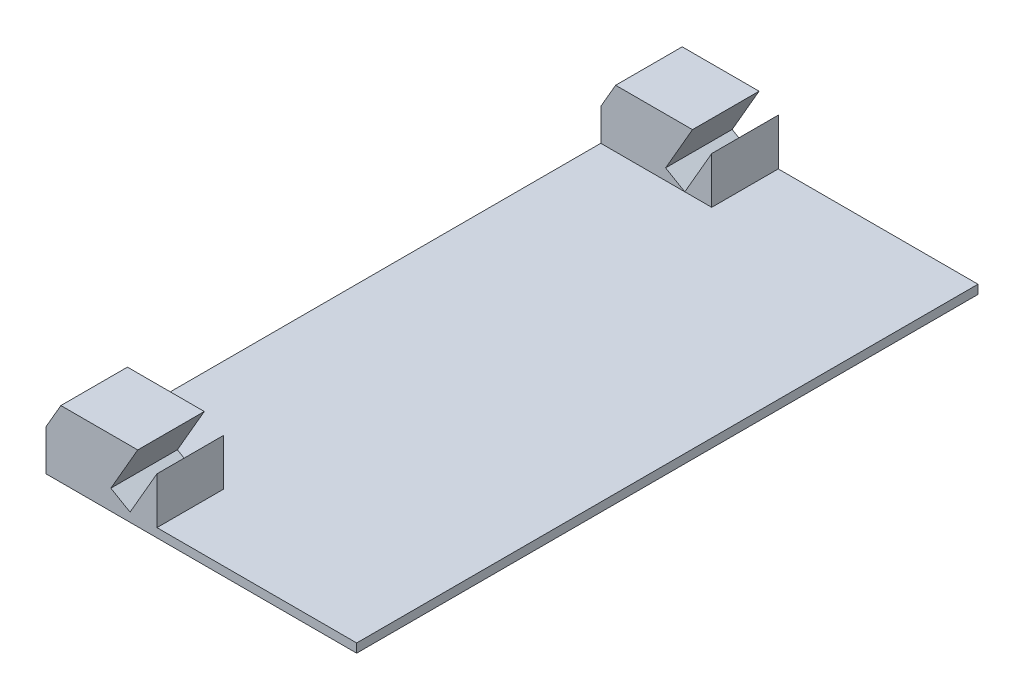
ISO-10303-21;
HEADER;
FILE_DESCRIPTION(('STEP AP214'),'2;1');
FILE_NAME('part.step','',(''),(''),'','','');
FILE_SCHEMA(('AUTOMOTIVE_DESIGN { 1 0 10303 214 1 1 1 1 }'));
ENDSEC;
DATA;
#1=APPLICATION_CONTEXT('core data for automotive mechanical design processes');
#2=APPLICATION_PROTOCOL_DEFINITION('international standard','automotive_design',2000,#1);
#3=PRODUCT_CONTEXT('',#1,'mechanical');
#4=PRODUCT('Part','Part','',(#3));
#5=PRODUCT_RELATED_PRODUCT_CATEGORY('part','',(#4));
#6=PRODUCT_DEFINITION_FORMATION('','',#4);
#7=PRODUCT_DEFINITION_CONTEXT('part definition',#1,'design');
#8=PRODUCT_DEFINITION('design','',#6,#7);
#9=PRODUCT_DEFINITION_SHAPE('','',#8);
#10=(LENGTH_UNIT() NAMED_UNIT(*) SI_UNIT(.MILLI.,.METRE.));
#11=(NAMED_UNIT(*) PLANE_ANGLE_UNIT() SI_UNIT($,.RADIAN.));
#12=(NAMED_UNIT(*) SI_UNIT($,.STERADIAN.) SOLID_ANGLE_UNIT());
#13=UNCERTAINTY_MEASURE_WITH_UNIT(LENGTH_MEASURE(1.E-05),#10,'distance_accuracy_value','');
#14=(GEOMETRIC_REPRESENTATION_CONTEXT(3) GLOBAL_UNCERTAINTY_ASSIGNED_CONTEXT((#13)) GLOBAL_UNIT_ASSIGNED_CONTEXT((#10,
#11,#12)) REPRESENTATION_CONTEXT('',''));
#15=CARTESIAN_POINT('',(0.,0.,0.));
#16=DIRECTION('',(0.,0.,1.));
#17=DIRECTION('',(1.,0.,0.));
#18=AXIS2_PLACEMENT_3D('',#15,#16,#17);
#19=CARTESIAN_POINT('',(-35.,2.,-70.));
#20=DIRECTION('',(0.,0.,1.));
#21=DIRECTION('',(1.,0.,0.));
#22=AXIS2_PLACEMENT_3D('',#19,#20,#21);
#23=PLANE('',#22);
#24=DIRECTION('',(0.,-1.,0.));
#25=VECTOR('',#24,1.);
#26=CARTESIAN_POINT('',(-35.,2.,-70.));
#27=LINE('',#26,#25);
#28=CARTESIAN_POINT('',(-35.,9.19872981077795,-70.));
#29=VERTEX_POINT('',#28);
#30=CARTESIAN_POINT('',(-35.,0.,-70.));
#31=VERTEX_POINT('',#30);
#32=EDGE_CURVE('E208',#29,#31,#27,.T.);
#33=ORIENTED_EDGE('',*,*,#32,.F.);
#34=DIRECTION('',(0.499999999999994,0.866025403784442,0.));
#35=VECTOR('',#34,1.);
#36=CARTESIAN_POINT('',(-30.2331668493416,17.455127018922,-70.));
#37=LINE('',#36,#35);
#38=CARTESIAN_POINT('',(-31.650635094611,15.,-70.));
#39=VERTEX_POINT('',#38);
#40=EDGE_CURVE('E190',#29,#39,#37,.T.);
#41=ORIENTED_EDGE('',*,*,#40,.T.);
#42=DIRECTION('',(-1.,0.,0.));
#43=VECTOR('',#42,1.);
#44=CARTESIAN_POINT('',(-35.,15.,-70.));
#45=LINE('',#44,#43);
#46=CARTESIAN_POINT('',(-14.3301270189222,15.,-70.));
#47=VERTEX_POINT('',#46);
#48=EDGE_CURVE('E269',#47,#39,#45,.T.);
#49=ORIENTED_EDGE('',*,*,#48,.F.);
#50=DIRECTION('',(0.499999999999997,0.86602540378444,0.));
#51=VECTOR('',#50,1.);
#52=CARTESIAN_POINT('',(-17.242785792575,9.95512701892214,-70.));
#53=LINE('',#52,#51);
#54=CARTESIAN_POINT('',(-20.3923048454133,4.49999999999997,-70.));
#55=VERTEX_POINT('',#54);
#56=EDGE_CURVE('E82',#55,#47,#53,.T.);
#57=ORIENTED_EDGE('',*,*,#56,.F.);
#58=DIRECTION('',(0.866025403784442,-0.499999999999994,0.));
#59=VECTOR('',#58,1.);
#60=CARTESIAN_POINT('',(-3.14951905283824,-5.45512701892213,-70.));
#61=LINE('',#60,#59);
#62=CARTESIAN_POINT('',(-16.0621778264911,2.,-70.));
#63=VERTEX_POINT('',#62);
#64=EDGE_CURVE('E347',#55,#63,#61,.T.);
#65=ORIENTED_EDGE('',*,*,#64,.T.);
#66=DIRECTION('',(0.499999999999997,0.86602540378444,0.));
#67=VECTOR('',#66,1.);
#68=CARTESIAN_POINT('',(-12.9126587736528,7.45512701892215,-70.));
#69=LINE('',#68,#67);
#70=CARTESIAN_POINT('',(-10.,12.5,-70.));
#71=VERTEX_POINT('',#70);
#72=EDGE_CURVE('E355',#63,#71,#69,.T.);
#73=ORIENTED_EDGE('',*,*,#72,.T.);
#74=DIRECTION('',(0.,-1.,0.));
#75=VECTOR('',#74,1.);
#76=CARTESIAN_POINT('',(-10.,15.,-70.));
#77=LINE('',#76,#75);
#78=CARTESIAN_POINT('',(-10.,2.,-70.));
#79=VERTEX_POINT('',#78);
#80=EDGE_CURVE('E273',#71,#79,#77,.T.);
#81=ORIENTED_EDGE('',*,*,#80,.T.);
#82=DIRECTION('',(-1.,0.,0.));
#83=VECTOR('',#82,1.);
#84=CARTESIAN_POINT('',(-35.,2.,-70.));
#85=LINE('',#84,#83);
#86=CARTESIAN_POINT('',(35.,2.,-70.));
#87=VERTEX_POINT('',#86);
#88=EDGE_CURVE('E294',#87,#79,#85,.T.);
#89=ORIENTED_EDGE('',*,*,#88,.F.);
#90=DIRECTION('',(0.,-1.,0.));
#91=VECTOR('',#90,1.);
#92=CARTESIAN_POINT('',(35.,2.,-70.));
#93=LINE('',#92,#91);
#94=CARTESIAN_POINT('',(35.,0.,-70.));
#95=VERTEX_POINT('',#94);
#96=EDGE_CURVE('E218',#87,#95,#93,.T.);
#97=ORIENTED_EDGE('',*,*,#96,.T.);
#98=DIRECTION('',(-1.,0.,0.));
#99=VECTOR('',#98,1.);
#100=CARTESIAN_POINT('',(-35.,0.,-70.));
#101=LINE('',#100,#99);
#102=EDGE_CURVE('E215',#95,#31,#101,.T.);
#103=ORIENTED_EDGE('',*,*,#102,.T.);
#104=EDGE_LOOP('',(#33,#41,#49,#57,#65,#73,#81,#89,#97,#103));
#105=FACE_BOUND('',#104,.T.);
#106=ADVANCED_FACE('F66',(#105),#23,.F.);
#107=CARTESIAN_POINT('',(-35.,2.,70.));
#108=DIRECTION('',(0.,0.,-1.));
#109=DIRECTION('',(-1.,0.,0.));
#110=AXIS2_PLACEMENT_3D('',#107,#108,#109);
#111=PLANE('',#110);
#112=DIRECTION('',(1.,0.,0.));
#113=VECTOR('',#112,1.);
#114=CARTESIAN_POINT('',(-35.,15.,70.));
#115=LINE('',#114,#113);
#116=CARTESIAN_POINT('',(-31.650635094611,15.,70.));
#117=VERTEX_POINT('',#116);
#118=CARTESIAN_POINT('',(-14.3301270189222,15.,70.));
#119=VERTEX_POINT('',#118);
#120=EDGE_CURVE('E382',#117,#119,#115,.T.);
#121=ORIENTED_EDGE('',*,*,#120,.F.);
#122=DIRECTION('',(0.499999999999994,0.866025403784442,0.));
#123=VECTOR('',#122,1.);
#124=CARTESIAN_POINT('',(-30.2331668493416,17.455127018922,70.));
#125=LINE('',#124,#123);
#126=CARTESIAN_POINT('',(-35.,9.19872981077795,70.));
#127=VERTEX_POINT('',#126);
#128=EDGE_CURVE('E201',#127,#117,#125,.T.);
#129=ORIENTED_EDGE('',*,*,#128,.F.);
#130=DIRECTION('',(0.,-1.,0.));
#131=VECTOR('',#130,1.);
#132=CARTESIAN_POINT('',(-35.,2.,70.));
#133=LINE('',#132,#131);
#134=CARTESIAN_POINT('',(-35.,0.,70.));
#135=VERTEX_POINT('',#134);
#136=EDGE_CURVE('E219',#127,#135,#133,.T.);
#137=ORIENTED_EDGE('',*,*,#136,.T.);
#138=DIRECTION('',(1.,0.,0.));
#139=VECTOR('',#138,1.);
#140=CARTESIAN_POINT('',(-35.,0.,70.));
#141=LINE('',#140,#139);
#142=CARTESIAN_POINT('',(35.,0.,70.));
#143=VERTEX_POINT('',#142);
#144=EDGE_CURVE('E295',#135,#143,#141,.T.);
#145=ORIENTED_EDGE('',*,*,#144,.T.);
#146=DIRECTION('',(0.,-1.,0.));
#147=VECTOR('',#146,1.);
#148=CARTESIAN_POINT('',(35.,2.,70.));
#149=LINE('',#148,#147);
#150=CARTESIAN_POINT('',(35.,2.,70.));
#151=VERTEX_POINT('',#150);
#152=EDGE_CURVE('E225',#151,#143,#149,.T.);
#153=ORIENTED_EDGE('',*,*,#152,.F.);
#154=DIRECTION('',(1.,0.,0.));
#155=VECTOR('',#154,1.);
#156=CARTESIAN_POINT('',(-35.,2.,70.));
#157=LINE('',#156,#155);
#158=CARTESIAN_POINT('',(-10.,2.,70.));
#159=VERTEX_POINT('',#158);
#160=EDGE_CURVE('E303',#159,#151,#157,.T.);
#161=ORIENTED_EDGE('',*,*,#160,.F.);
#162=DIRECTION('',(0.,-1.,0.));
#163=VECTOR('',#162,1.);
#164=CARTESIAN_POINT('',(-10.,15.,70.));
#165=LINE('',#164,#163);
#166=CARTESIAN_POINT('',(-10.,12.5,70.));
#167=VERTEX_POINT('',#166);
#168=EDGE_CURVE('E254',#167,#159,#165,.T.);
#169=ORIENTED_EDGE('',*,*,#168,.F.);
#170=DIRECTION('',(0.499999999999997,0.86602540378444,0.));
#171=VECTOR('',#170,1.);
#172=CARTESIAN_POINT('',(-12.9126587736528,7.45512701892215,70.));
#173=LINE('',#172,#171);
#174=CARTESIAN_POINT('',(-16.0621778264911,2.,70.));
#175=VERTEX_POINT('',#174);
#176=EDGE_CURVE('E337',#175,#167,#173,.T.);
#177=ORIENTED_EDGE('',*,*,#176,.F.);
#178=DIRECTION('',(0.866025403784442,-0.499999999999994,0.));
#179=VECTOR('',#178,1.);
#180=CARTESIAN_POINT('',(-3.14951905283824,-5.45512701892213,70.));
#181=LINE('',#180,#179);
#182=CARTESIAN_POINT('',(-20.3923048454133,4.49999999999997,70.));
#183=VERTEX_POINT('',#182);
#184=EDGE_CURVE('E340',#183,#175,#181,.T.);
#185=ORIENTED_EDGE('',*,*,#184,.F.);
#186=DIRECTION('',(0.499999999999997,0.86602540378444,0.));
#187=VECTOR('',#186,1.);
#188=CARTESIAN_POINT('',(-17.242785792575,9.95512701892214,70.));
#189=LINE('',#188,#187);
#190=EDGE_CURVE('E345',#183,#119,#189,.T.);
#191=ORIENTED_EDGE('',*,*,#190,.T.);
#192=EDGE_LOOP('',(#121,#129,#137,#145,#153,#161,#169,#177,#185,#191));
#193=FACE_BOUND('',#192,.T.);
#194=ADVANCED_FACE('F334',(#193),#111,.F.);
#195=CARTESIAN_POINT('',(-35.,15.,-55.));
#196=DIRECTION('',(0.,0.,-1.));
#197=DIRECTION('',(-1.,0.,0.));
#198=AXIS2_PLACEMENT_3D('',#195,#196,#197);
#199=PLANE('',#198);
#200=DIRECTION('',(1.,0.,0.));
#201=VECTOR('',#200,1.);
#202=CARTESIAN_POINT('',(-35.,15.,-55.));
#203=LINE('',#202,#201);
#204=CARTESIAN_POINT('',(-31.650635094611,15.,-55.));
#205=VERTEX_POINT('',#204);
#206=CARTESIAN_POINT('',(-14.3301270189222,15.,-55.));
#207=VERTEX_POINT('',#206);
#208=EDGE_CURVE('E265',#205,#207,#203,.T.);
#209=ORIENTED_EDGE('',*,*,#208,.F.);
#210=DIRECTION('',(-0.499999999999994,-0.866025403784442,0.));
#211=VECTOR('',#210,1.);
#212=CARTESIAN_POINT('',(-32.4879763209582,13.5496824526945,-55.));
#213=LINE('',#212,#211);
#214=CARTESIAN_POINT('',(-35.,9.19872981077795,-55.));
#215=VERTEX_POINT('',#214);
#216=EDGE_CURVE('E90',#205,#215,#213,.T.);
#217=ORIENTED_EDGE('',*,*,#216,.T.);
#218=DIRECTION('',(0.,-1.,0.));
#219=VECTOR('',#218,1.);
#220=CARTESIAN_POINT('',(-35.,15.,-55.));
#221=LINE('',#220,#219);
#222=CARTESIAN_POINT('',(-35.,2.,-55.));
#223=VERTEX_POINT('',#222);
#224=EDGE_CURVE('E211',#215,#223,#221,.T.);
#225=ORIENTED_EDGE('',*,*,#224,.T.);
#226=DIRECTION('',(1.,0.,0.));
#227=VECTOR('',#226,1.);
#228=CARTESIAN_POINT('',(-35.,2.,-55.));
#229=LINE('',#228,#227);
#230=CARTESIAN_POINT('',(-16.0621778264911,2.,-55.));
#231=VERTEX_POINT('',#230);
#232=EDGE_CURVE('E274',#223,#231,#229,.T.);
#233=ORIENTED_EDGE('',*,*,#232,.T.);
#234=DIRECTION('',(-0.866025403784442,0.499999999999994,0.));
#235=VECTOR('',#234,1.);
#236=CARTESIAN_POINT('',(-35.8947095812217,13.4503175473053,-55.));
#237=LINE('',#236,#235);
#238=CARTESIAN_POINT('',(-20.3923048454133,4.49999999999997,-55.));
#239=VERTEX_POINT('',#238);
#240=EDGE_CURVE('E378',#231,#239,#237,.T.);
#241=ORIENTED_EDGE('',*,*,#240,.T.);
#242=DIRECTION('',(-0.499999999999997,-0.86602540378444,0.));
#243=VECTOR('',#242,1.);
#244=CARTESIAN_POINT('',(-19.4975952641916,6.04968245269456,-55.));
#245=LINE('',#244,#243);
#246=EDGE_CURVE('E365',#207,#239,#245,.T.);
#247=ORIENTED_EDGE('',*,*,#246,.F.);
#248=EDGE_LOOP('',(#209,#217,#225,#233,#241,#247));
#249=FACE_BOUND('',#248,.T.);
#250=ADVANCED_FACE('F432',(#249),#199,.F.);
#251=CARTESIAN_POINT('',(0.,15.,0.));
#252=DIRECTION('',(0.,1.,0.));
#253=DIRECTION('',(0.,0.,1.));
#254=AXIS2_PLACEMENT_3D('',#251,#252,#253);
#255=PLANE('',#254);
#256=DIRECTION('',(0.,0.,1.));
#257=VECTOR('',#256,1.);
#258=CARTESIAN_POINT('',(-31.650635094611,15.,-70.));
#259=LINE('',#258,#257);
#260=EDGE_CURVE('E194',#39,#205,#259,.T.);
#261=ORIENTED_EDGE('',*,*,#260,.T.);
#262=ORIENTED_EDGE('',*,*,#208,.T.);
#263=DIRECTION('',(0.,0.,1.));
#264=VECTOR('',#263,1.);
#265=CARTESIAN_POINT('',(-14.3301270189222,15.,-70.));
#266=LINE('',#265,#264);
#267=EDGE_CURVE('E358',#47,#207,#266,.T.);
#268=ORIENTED_EDGE('',*,*,#267,.F.);
#269=ORIENTED_EDGE('',*,*,#48,.T.);
#270=EDGE_LOOP('',(#261,#262,#268,#269));
#271=FACE_BOUND('',#270,.T.);
#272=ADVANCED_FACE('F435',(#271),#255,.T.);
#273=CARTESIAN_POINT('',(-35.,15.,55.));
#274=DIRECTION('',(0.,0.,1.));
#275=DIRECTION('',(1.,0.,0.));
#276=AXIS2_PLACEMENT_3D('',#273,#274,#275);
#277=PLANE('',#276);
#278=DIRECTION('',(0.,-1.,0.));
#279=VECTOR('',#278,1.);
#280=CARTESIAN_POINT('',(-35.,15.,55.));
#281=LINE('',#280,#279);
#282=CARTESIAN_POINT('',(-35.,9.19872981077795,55.));
#283=VERTEX_POINT('',#282);
#284=CARTESIAN_POINT('',(-35.,2.,55.));
#285=VERTEX_POINT('',#284);
#286=EDGE_CURVE('E255',#283,#285,#281,.T.);
#287=ORIENTED_EDGE('',*,*,#286,.F.);
#288=DIRECTION('',(0.499999999999994,0.866025403784442,0.));
#289=VECTOR('',#288,1.);
#290=CARTESIAN_POINT('',(-32.4879763209582,13.5496824526945,55.));
#291=LINE('',#290,#289);
#292=CARTESIAN_POINT('',(-31.650635094611,15.,55.));
#293=VERTEX_POINT('',#292);
#294=EDGE_CURVE('E368',#283,#293,#291,.T.);
#295=ORIENTED_EDGE('',*,*,#294,.T.);
#296=DIRECTION('',(-1.,0.,0.));
#297=VECTOR('',#296,1.);
#298=CARTESIAN_POINT('',(-35.,15.,55.));
#299=LINE('',#298,#297);
#300=CARTESIAN_POINT('',(-14.3301270189222,15.,55.));
#301=VERTEX_POINT('',#300);
#302=EDGE_CURVE('E261',#301,#293,#299,.T.);
#303=ORIENTED_EDGE('',*,*,#302,.F.);
#304=DIRECTION('',(0.499999999999997,0.86602540378444,0.));
#305=VECTOR('',#304,1.);
#306=CARTESIAN_POINT('',(-19.4975952641916,6.04968245269456,55.));
#307=LINE('',#306,#305);
#308=CARTESIAN_POINT('',(-20.3923048454133,4.49999999999997,55.));
#309=VERTEX_POINT('',#308);
#310=EDGE_CURVE('E362',#309,#301,#307,.T.);
#311=ORIENTED_EDGE('',*,*,#310,.F.);
#312=DIRECTION('',(0.866025403784442,-0.499999999999994,0.));
#313=VECTOR('',#312,1.);
#314=CARTESIAN_POINT('',(-35.8947095812217,13.4503175473053,55.));
#315=LINE('',#314,#313);
#316=CARTESIAN_POINT('',(-16.0621778264911,2.,55.));
#317=VERTEX_POINT('',#316);
#318=EDGE_CURVE('E12',#309,#317,#315,.T.);
#319=ORIENTED_EDGE('',*,*,#318,.T.);
#320=DIRECTION('',(-1.,0.,0.));
#321=VECTOR('',#320,1.);
#322=CARTESIAN_POINT('',(-35.,2.,55.));
#323=LINE('',#322,#321);
#324=EDGE_CURVE('E390',#317,#285,#323,.T.);
#325=ORIENTED_EDGE('',*,*,#324,.T.);
#326=EDGE_LOOP('',(#287,#295,#303,#311,#319,#325));
#327=FACE_BOUND('',#326,.T.);
#328=ADVANCED_FACE('F397',(#327),#277,.F.);
#329=CARTESIAN_POINT('',(0.,15.,0.));
#330=DIRECTION('',(0.,-1.,0.));
#331=DIRECTION('',(0.,0.,-1.));
#332=AXIS2_PLACEMENT_3D('',#329,#330,#331);
#333=PLANE('',#332);
#334=ORIENTED_EDGE('',*,*,#302,.T.);
#335=DIRECTION('',(0.,0.,1.));
#336=VECTOR('',#335,1.);
#337=CARTESIAN_POINT('',(-31.650635094611,15.,0.));
#338=LINE('',#337,#336);
#339=EDGE_CURVE('E231',#293,#117,#338,.T.);
#340=ORIENTED_EDGE('',*,*,#339,.T.);
#341=ORIENTED_EDGE('',*,*,#120,.T.);
#342=DIRECTION('',(0.,0.,1.));
#343=VECTOR('',#342,1.);
#344=CARTESIAN_POINT('',(-14.3301270189222,15.,0.));
#345=LINE('',#344,#343);
#346=EDGE_CURVE('E223',#301,#119,#345,.T.);
#347=ORIENTED_EDGE('',*,*,#346,.F.);
#348=EDGE_LOOP('',(#334,#340,#341,#347));
#349=FACE_BOUND('',#348,.T.);
#350=ADVANCED_FACE('F469',(#349),#333,.F.);
#351=CARTESIAN_POINT('',(0.,2.,0.));
#352=DIRECTION('',(0.,-1.,0.));
#353=DIRECTION('',(0.,0.,-1.));
#354=AXIS2_PLACEMENT_3D('',#351,#352,#353);
#355=PLANE('',#354);
#356=CARTESIAN_POINT('',(-10.,2.,-55.));
#357=VERTEX_POINT('',#356);
#358=EDGE_CURVE('E259',#231,#357,#229,.T.);
#359=ORIENTED_EDGE('',*,*,#358,.F.);
#360=ORIENTED_EDGE('',*,*,#232,.F.);
#361=DIRECTION('',(0.,0.,1.));
#362=VECTOR('',#361,1.);
#363=CARTESIAN_POINT('',(-35.,2.,70.));
#364=LINE('',#363,#362);
#365=EDGE_CURVE('E299',#223,#285,#364,.T.);
#366=ORIENTED_EDGE('',*,*,#365,.T.);
#367=ORIENTED_EDGE('',*,*,#324,.F.);
#368=CARTESIAN_POINT('',(-10.,2.,55.));
#369=VERTEX_POINT('',#368);
#370=EDGE_CURVE('E242',#369,#317,#323,.T.);
#371=ORIENTED_EDGE('',*,*,#370,.F.);
#372=DIRECTION('',(0.,0.,-1.));
#373=VECTOR('',#372,1.);
#374=CARTESIAN_POINT('',(-10.,2.,70.));
#375=LINE('',#374,#373);
#376=EDGE_CURVE('E252',#159,#369,#375,.T.);
#377=ORIENTED_EDGE('',*,*,#376,.F.);
#378=ORIENTED_EDGE('',*,*,#160,.T.);
#379=DIRECTION('',(0.,0.,-1.));
#380=VECTOR('',#379,1.);
#381=CARTESIAN_POINT('',(35.,2.,70.));
#382=LINE('',#381,#380);
#383=EDGE_CURVE('E290',#151,#87,#382,.T.);
#384=ORIENTED_EDGE('',*,*,#383,.T.);
#385=ORIENTED_EDGE('',*,*,#88,.T.);
#386=DIRECTION('',(0.,0.,-1.));
#387=VECTOR('',#386,1.);
#388=CARTESIAN_POINT('',(-10.,2.,-70.));
#389=LINE('',#388,#387);
#390=EDGE_CURVE('E270',#357,#79,#389,.T.);
#391=ORIENTED_EDGE('',*,*,#390,.F.);
#392=EDGE_LOOP('',(#359,#360,#366,#367,#371,#377,#378,#384,#385,#391));
#393=FACE_BOUND('',#392,.T.);
#394=ADVANCED_FACE('F332',(#393),#355,.F.);
#395=CARTESIAN_POINT('',(35.,2.,70.));
#396=DIRECTION('',(-1.,0.,0.));
#397=DIRECTION('',(0.,0.,1.));
#398=AXIS2_PLACEMENT_3D('',#395,#396,#397);
#399=PLANE('',#398);
#400=DIRECTION('',(0.,0.,-1.));
#401=VECTOR('',#400,1.);
#402=CARTESIAN_POINT('',(35.,0.,70.));
#403=LINE('',#402,#401);
#404=EDGE_CURVE('E289',#143,#95,#403,.T.);
#405=ORIENTED_EDGE('',*,*,#404,.T.);
#406=ORIENTED_EDGE('',*,*,#96,.F.);
#407=ORIENTED_EDGE('',*,*,#383,.F.);
#408=ORIENTED_EDGE('',*,*,#152,.T.);
#409=EDGE_LOOP('',(#405,#406,#407,#408));
#410=FACE_BOUND('',#409,.T.);
#411=ADVANCED_FACE('F68',(#410),#399,.F.);
#412=CARTESIAN_POINT('',(-35.,2.,70.));
#413=DIRECTION('',(1.,0.,0.));
#414=DIRECTION('',(0.,0.,-1.));
#415=AXIS2_PLACEMENT_3D('',#412,#413,#414);
#416=PLANE('',#415);
#417=ORIENTED_EDGE('',*,*,#136,.F.);
#418=DIRECTION('',(0.,0.,1.));
#419=VECTOR('',#418,1.);
#420=CARTESIAN_POINT('',(-35.,9.19872981077795,-70.));
#421=LINE('',#420,#419);
#422=EDGE_CURVE('E200',#283,#127,#421,.T.);
#423=ORIENTED_EDGE('',*,*,#422,.F.);
#424=ORIENTED_EDGE('',*,*,#286,.T.);
#425=ORIENTED_EDGE('',*,*,#365,.F.);
#426=ORIENTED_EDGE('',*,*,#224,.F.);
#427=EDGE_CURVE('E193',#29,#215,#421,.T.);
#428=ORIENTED_EDGE('',*,*,#427,.F.);
#429=ORIENTED_EDGE('',*,*,#32,.T.);
#430=DIRECTION('',(0.,0.,1.));
#431=VECTOR('',#430,1.);
#432=CARTESIAN_POINT('',(-35.,0.,70.));
#433=LINE('',#432,#431);
#434=EDGE_CURVE('E311',#31,#135,#433,.T.);
#435=ORIENTED_EDGE('',*,*,#434,.T.);
#436=EDGE_LOOP('',(#417,#423,#424,#425,#426,#428,#429,#435));
#437=FACE_BOUND('',#436,.T.);
#438=ADVANCED_FACE('F206',(#437),#416,.F.);
#439=CARTESIAN_POINT('',(0.,0.,0.));
#440=DIRECTION('',(0.,-1.,0.));
#441=DIRECTION('',(0.,0.,-1.));
#442=AXIS2_PLACEMENT_3D('',#439,#440,#441);
#443=PLANE('',#442);
#444=ORIENTED_EDGE('',*,*,#404,.F.);
#445=ORIENTED_EDGE('',*,*,#144,.F.);
#446=ORIENTED_EDGE('',*,*,#434,.F.);
#447=ORIENTED_EDGE('',*,*,#102,.F.);
#448=EDGE_LOOP('',(#444,#445,#446,#447));
#449=FACE_BOUND('',#448,.T.);
#450=ADVANCED_FACE('F326',(#449),#443,.T.);
#451=DIRECTION('',(0.,-1.,0.));
#452=VECTOR('',#451,1.);
#453=CARTESIAN_POINT('',(-10.,15.,-55.));
#454=LINE('',#453,#452);
#455=CARTESIAN_POINT('',(-10.,12.5,-55.));
#456=VERTEX_POINT('',#455);
#457=EDGE_CURVE('E283',#456,#357,#454,.T.);
#458=ORIENTED_EDGE('',*,*,#457,.F.);
#459=DIRECTION('',(-0.499999999999997,-0.86602540378444,0.));
#460=VECTOR('',#459,1.);
#461=CARTESIAN_POINT('',(-15.1674682452694,3.54968245269457,-55.));
#462=LINE('',#461,#460);
#463=EDGE_CURVE('E374',#456,#231,#462,.T.);
#464=ORIENTED_EDGE('',*,*,#463,.T.);
#465=ORIENTED_EDGE('',*,*,#358,.T.);
#466=EDGE_LOOP('',(#458,#464,#465));
#467=FACE_BOUND('',#466,.T.);
#468=ADVANCED_FACE('F428',(#467),#199,.F.);
#469=CARTESIAN_POINT('',(-10.,15.,-70.));
#470=DIRECTION('',(-1.,0.,0.));
#471=DIRECTION('',(0.,0.,1.));
#472=AXIS2_PLACEMENT_3D('',#469,#470,#471);
#473=PLANE('',#472);
#474=ORIENTED_EDGE('',*,*,#80,.F.);
#475=DIRECTION('',(0.,0.,1.));
#476=VECTOR('',#475,1.);
#477=CARTESIAN_POINT('',(-10.,12.5,-70.));
#478=LINE('',#477,#476);
#479=EDGE_CURVE('E350',#71,#456,#478,.T.);
#480=ORIENTED_EDGE('',*,*,#479,.T.);
#481=ORIENTED_EDGE('',*,*,#457,.T.);
#482=ORIENTED_EDGE('',*,*,#390,.T.);
#483=EDGE_LOOP('',(#474,#480,#481,#482));
#484=FACE_BOUND('',#483,.T.);
#485=ADVANCED_FACE('F426',(#484),#473,.F.);
#486=CARTESIAN_POINT('',(-10.,15.,70.));
#487=DIRECTION('',(-1.,0.,0.));
#488=DIRECTION('',(0.,0.,1.));
#489=AXIS2_PLACEMENT_3D('',#486,#487,#488);
#490=PLANE('',#489);
#491=DIRECTION('',(0.,-1.,0.));
#492=VECTOR('',#491,1.);
#493=CARTESIAN_POINT('',(-10.,15.,55.));
#494=LINE('',#493,#492);
#495=CARTESIAN_POINT('',(-10.,12.5,55.));
#496=VERTEX_POINT('',#495);
#497=EDGE_CURVE('E240',#496,#369,#494,.T.);
#498=ORIENTED_EDGE('',*,*,#497,.F.);
#499=EDGE_CURVE('E249',#496,#167,#478,.T.);
#500=ORIENTED_EDGE('',*,*,#499,.T.);
#501=ORIENTED_EDGE('',*,*,#168,.T.);
#502=ORIENTED_EDGE('',*,*,#376,.T.);
#503=EDGE_LOOP('',(#498,#500,#501,#502));
#504=FACE_BOUND('',#503,.T.);
#505=ADVANCED_FACE('F248',(#504),#490,.F.);
#506=ORIENTED_EDGE('',*,*,#370,.T.);
#507=DIRECTION('',(0.499999999999997,0.86602540378444,0.));
#508=VECTOR('',#507,1.);
#509=CARTESIAN_POINT('',(-15.1674682452694,3.54968245269457,55.));
#510=LINE('',#509,#508);
#511=EDGE_CURVE('E75',#317,#496,#510,.T.);
#512=ORIENTED_EDGE('',*,*,#511,.T.);
#513=ORIENTED_EDGE('',*,*,#497,.T.);
#514=EDGE_LOOP('',(#506,#512,#513));
#515=FACE_BOUND('',#514,.T.);
#516=ADVANCED_FACE('F239',(#515),#277,.F.);
#517=CARTESIAN_POINT('',(-12.9126587736528,7.45512701892215,-70.));
#518=DIRECTION('',(0.86602540378444,-0.499999999999997,0.));
#519=DIRECTION('',(0.499999999999997,0.86602540378444,0.));
#520=AXIS2_PLACEMENT_3D('',#517,#518,#519);
#521=PLANE('',#520);
#522=DIRECTION('',(0.,0.,1.));
#523=VECTOR('',#522,1.);
#524=CARTESIAN_POINT('',(-16.0621778264911,2.,-70.));
#525=LINE('',#524,#523);
#526=EDGE_CURVE('E416',#317,#175,#525,.T.);
#527=ORIENTED_EDGE('',*,*,#526,.T.);
#528=ORIENTED_EDGE('',*,*,#176,.T.);
#529=ORIENTED_EDGE('',*,*,#499,.F.);
#530=ORIENTED_EDGE('',*,*,#511,.F.);
#531=EDGE_LOOP('',(#527,#528,#529,#530));
#532=FACE_BOUND('',#531,.T.);
#533=ADVANCED_FACE('F452',(#532),#521,.F.);
#534=CARTESIAN_POINT('',(-17.242785792575,9.95512701892214,-70.));
#535=DIRECTION('',(0.86602540378444,-0.499999999999997,0.));
#536=DIRECTION('',(0.499999999999997,0.86602540378444,0.));
#537=AXIS2_PLACEMENT_3D('',#534,#535,#536);
#538=PLANE('',#537);
#539=ORIENTED_EDGE('',*,*,#310,.T.);
#540=ORIENTED_EDGE('',*,*,#346,.T.);
#541=ORIENTED_EDGE('',*,*,#190,.F.);
#542=DIRECTION('',(0.,0.,1.));
#543=VECTOR('',#542,1.);
#544=CARTESIAN_POINT('',(-20.3923048454133,4.49999999999997,-70.));
#545=LINE('',#544,#543);
#546=EDGE_CURVE('E412',#309,#183,#545,.T.);
#547=ORIENTED_EDGE('',*,*,#546,.F.);
#548=EDGE_LOOP('',(#539,#540,#541,#547));
#549=FACE_BOUND('',#548,.T.);
#550=ADVANCED_FACE('F444',(#549),#538,.T.);
#551=CARTESIAN_POINT('',(-3.14951905283824,-5.45512701892213,-70.));
#552=DIRECTION('',(-0.499999999999994,-0.866025403784442,0.));
#553=DIRECTION('',(0.866025403784442,-0.499999999999994,0.));
#554=AXIS2_PLACEMENT_3D('',#551,#552,#553);
#555=PLANE('',#554);
#556=ORIENTED_EDGE('',*,*,#546,.T.);
#557=ORIENTED_EDGE('',*,*,#184,.T.);
#558=ORIENTED_EDGE('',*,*,#526,.F.);
#559=ORIENTED_EDGE('',*,*,#318,.F.);
#560=EDGE_LOOP('',(#556,#557,#558,#559));
#561=FACE_BOUND('',#560,.T.);
#562=ADVANCED_FACE('F455',(#561),#555,.F.);
#563=CARTESIAN_POINT('',(-30.2331668493416,17.455127018922,-70.));
#564=DIRECTION('',(0.866025403784442,-0.499999999999994,0.));
#565=DIRECTION('',(0.499999999999994,0.866025403784442,0.));
#566=AXIS2_PLACEMENT_3D('',#563,#564,#565);
#567=PLANE('',#566);
#568=ORIENTED_EDGE('',*,*,#422,.T.);
#569=ORIENTED_EDGE('',*,*,#128,.T.);
#570=ORIENTED_EDGE('',*,*,#339,.F.);
#571=ORIENTED_EDGE('',*,*,#294,.F.);
#572=EDGE_LOOP('',(#568,#569,#570,#571));
#573=FACE_BOUND('',#572,.T.);
#574=ADVANCED_FACE('F450',(#573),#567,.F.);
#575=EDGE_CURVE('E413',#63,#231,#525,.T.);
#576=ORIENTED_EDGE('',*,*,#575,.F.);
#577=ORIENTED_EDGE('',*,*,#64,.F.);
#578=EDGE_CURVE('E409',#55,#239,#545,.T.);
#579=ORIENTED_EDGE('',*,*,#578,.T.);
#580=ORIENTED_EDGE('',*,*,#240,.F.);
#581=EDGE_LOOP('',(#576,#577,#579,#580));
#582=FACE_BOUND('',#581,.T.);
#583=ADVANCED_FACE('F439',(#582),#555,.F.);
#584=ORIENTED_EDGE('',*,*,#479,.F.);
#585=ORIENTED_EDGE('',*,*,#72,.F.);
#586=ORIENTED_EDGE('',*,*,#575,.T.);
#587=ORIENTED_EDGE('',*,*,#463,.F.);
#588=EDGE_LOOP('',(#584,#585,#586,#587));
#589=FACE_BOUND('',#588,.T.);
#590=ADVANCED_FACE('F442',(#589),#521,.F.);
#591=ORIENTED_EDGE('',*,*,#246,.T.);
#592=ORIENTED_EDGE('',*,*,#578,.F.);
#593=ORIENTED_EDGE('',*,*,#56,.T.);
#594=ORIENTED_EDGE('',*,*,#267,.T.);
#595=EDGE_LOOP('',(#591,#592,#593,#594));
#596=FACE_BOUND('',#595,.T.);
#597=ADVANCED_FACE('F440',(#596),#538,.T.);
#598=ORIENTED_EDGE('',*,*,#260,.F.);
#599=ORIENTED_EDGE('',*,*,#40,.F.);
#600=ORIENTED_EDGE('',*,*,#427,.T.);
#601=ORIENTED_EDGE('',*,*,#216,.F.);
#602=EDGE_LOOP('',(#598,#599,#600,#601));
#603=FACE_BOUND('',#602,.T.);
#604=ADVANCED_FACE('F192',(#603),#567,.F.);
#605=CLOSED_SHELL('',(#106,#194,#250,#272,#328,#350,#394,#411,#438,#450,#468,#485,#505,#516,
#533,#550,#562,#574,#583,#590,#597,#604));
#606=MANIFOLD_SOLID_BREP('B2',#605);
#607=ADVANCED_BREP_SHAPE_REPRESENTATION('',(#18,#606),#14);
#608=SHAPE_DEFINITION_REPRESENTATION(#9,#607);
ENDSEC;
END-ISO-10303-21;
